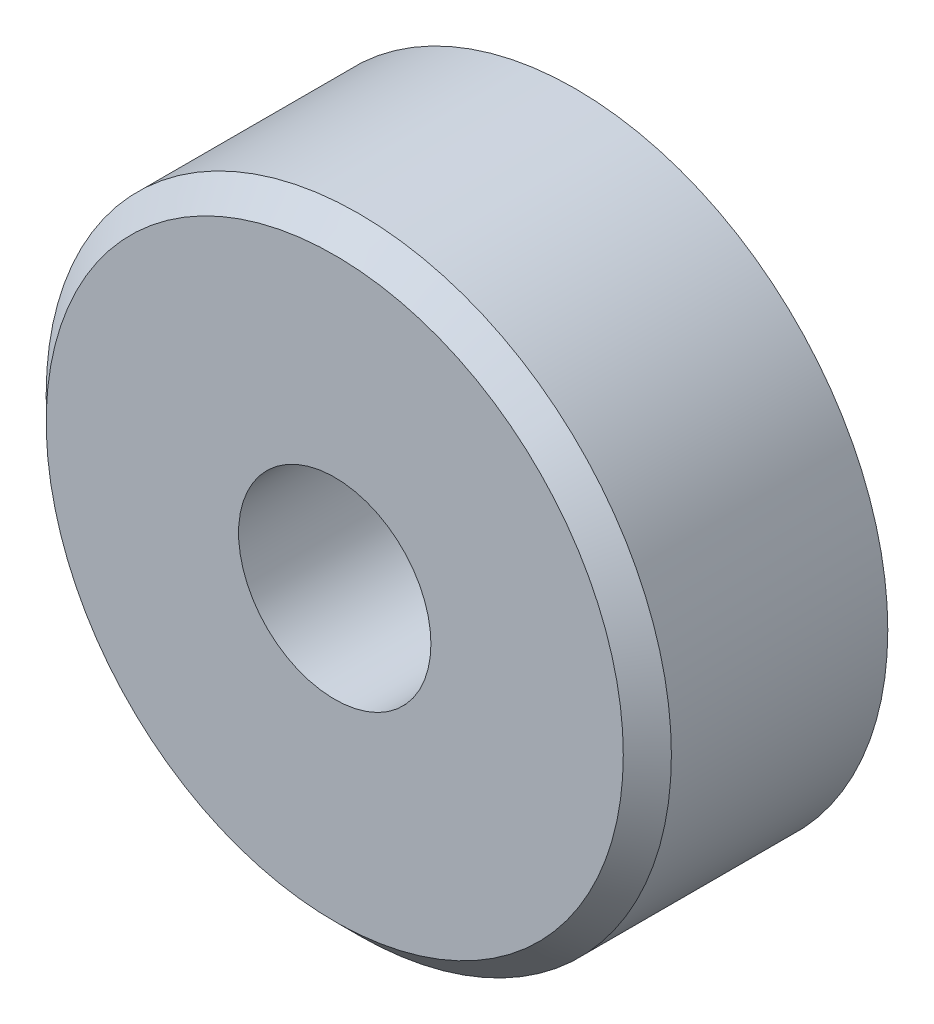
ISO-10303-21;
HEADER;
FILE_DESCRIPTION(('STEP AP214'),'2;1');
FILE_NAME('part.step','',(''),(''),'','','');
FILE_SCHEMA(('AUTOMOTIVE_DESIGN { 1 0 10303 214 1 1 1 1 }'));
ENDSEC;
DATA;
#1=APPLICATION_CONTEXT('core data for automotive mechanical design processes');
#2=APPLICATION_PROTOCOL_DEFINITION('international standard','automotive_design',2000,#1);
#3=PRODUCT_CONTEXT('',#1,'mechanical');
#4=PRODUCT('Part','Part','',(#3));
#5=PRODUCT_RELATED_PRODUCT_CATEGORY('part','',(#4));
#6=PRODUCT_DEFINITION_FORMATION('','',#4);
#7=PRODUCT_DEFINITION_CONTEXT('part definition',#1,'design');
#8=PRODUCT_DEFINITION('design','',#6,#7);
#9=PRODUCT_DEFINITION_SHAPE('','',#8);
#10=(LENGTH_UNIT() NAMED_UNIT(*) SI_UNIT(.MILLI.,.METRE.));
#11=(NAMED_UNIT(*) PLANE_ANGLE_UNIT() SI_UNIT($,.RADIAN.));
#12=(NAMED_UNIT(*) SI_UNIT($,.STERADIAN.) SOLID_ANGLE_UNIT());
#13=UNCERTAINTY_MEASURE_WITH_UNIT(LENGTH_MEASURE(1.E-05),#10,'distance_accuracy_value','');
#14=(GEOMETRIC_REPRESENTATION_CONTEXT(3) GLOBAL_UNCERTAINTY_ASSIGNED_CONTEXT((#13)) GLOBAL_UNIT_ASSIGNED_CONTEXT((#10,
#11,#12)) REPRESENTATION_CONTEXT('',''));
#15=CARTESIAN_POINT('',(0.,0.,0.));
#16=DIRECTION('',(0.,0.,1.));
#17=DIRECTION('',(1.,0.,0.));
#18=AXIS2_PLACEMENT_3D('',#15,#16,#17);
#19=CARTESIAN_POINT('',(0.,0.,2.5));
#20=DIRECTION('',(0.,0.,1.));
#21=DIRECTION('',(1.,0.,0.));
#22=AXIS2_PLACEMENT_3D('',#19,#20,#21);
#23=PLANE('',#22);
#24=CARTESIAN_POINT('',(0.,0.,2.5));
#25=DIRECTION('',(0.,0.,1.));
#26=DIRECTION('',(1.,0.,0.));
#27=AXIS2_PLACEMENT_3D('',#24,#25,#26);
#28=CIRCLE('',#27,3.);
#29=CARTESIAN_POINT('',(3.,0.,2.5));
#30=VERTEX_POINT('',#29);
#31=EDGE_CURVE('E41',#30,#30,#28,.T.);
#32=ORIENTED_EDGE('',*,*,#31,.T.);
#33=EDGE_LOOP('',(#32));
#34=FACE_BOUND('',#33,.T.);
#35=CARTESIAN_POINT('',(0.,0.,2.5));
#36=DIRECTION('',(0.,0.,1.));
#37=DIRECTION('',(1.,0.,0.));
#38=AXIS2_PLACEMENT_3D('',#35,#36,#37);
#39=CIRCLE('',#38,1.);
#40=CARTESIAN_POINT('',(1.,0.,2.5));
#41=VERTEX_POINT('',#40);
#42=EDGE_CURVE('E49',#41,#41,#39,.T.);
#43=ORIENTED_EDGE('',*,*,#42,.F.);
#44=EDGE_LOOP('',(#43));
#45=FACE_BOUND('',#44,.T.);
#46=ADVANCED_FACE('F33',(#34,#45),#23,.T.);
#47=CARTESIAN_POINT('',(0.,0.,0.));
#48=DIRECTION('',(0.,0.,1.));
#49=DIRECTION('',(1.,0.,0.));
#50=AXIS2_PLACEMENT_3D('',#47,#48,#49);
#51=PLANE('',#50);
#52=CARTESIAN_POINT('',(0.,0.,0.));
#53=DIRECTION('',(0.,0.,1.));
#54=DIRECTION('',(1.,0.,0.));
#55=AXIS2_PLACEMENT_3D('',#52,#53,#54);
#56=CIRCLE('',#55,3.25);
#57=CARTESIAN_POINT('',(3.25,0.,0.));
#58=VERTEX_POINT('',#57);
#59=EDGE_CURVE('E45',#58,#58,#56,.T.);
#60=ORIENTED_EDGE('',*,*,#59,.F.);
#61=EDGE_LOOP('',(#60));
#62=FACE_BOUND('',#61,.T.);
#63=CARTESIAN_POINT('',(0.,0.,0.));
#64=DIRECTION('',(0.,0.,1.));
#65=DIRECTION('',(1.,0.,0.));
#66=AXIS2_PLACEMENT_3D('',#63,#64,#65);
#67=CIRCLE('',#66,1.);
#68=CARTESIAN_POINT('',(1.,0.,0.));
#69=VERTEX_POINT('',#68);
#70=EDGE_CURVE('E52',#69,#69,#67,.T.);
#71=ORIENTED_EDGE('',*,*,#70,.T.);
#72=EDGE_LOOP('',(#71));
#73=FACE_BOUND('',#72,.T.);
#74=ADVANCED_FACE('F62',(#62,#73),#51,.F.);
#75=CARTESIAN_POINT('',(0.,0.,2.5));
#76=DIRECTION('',(0.,0.,-1.));
#77=DIRECTION('',(-1.,0.,0.));
#78=AXIS2_PLACEMENT_3D('',#75,#76,#77);
#79=CYLINDRICAL_SURFACE('',#78,3.25);
#80=CARTESIAN_POINT('',(0.,0.,2.25));
#81=DIRECTION('',(0.,0.,1.));
#82=DIRECTION('',(1.,0.,0.));
#83=AXIS2_PLACEMENT_3D('',#80,#81,#82);
#84=CIRCLE('',#83,3.25);
#85=CARTESIAN_POINT('',(3.25,0.,2.25));
#86=VERTEX_POINT('',#85);
#87=EDGE_CURVE('E10',#86,#86,#84,.F.);
#88=ORIENTED_EDGE('',*,*,#87,.T.);
#89=EDGE_LOOP('',(#88));
#90=FACE_BOUND('',#89,.T.);
#91=ORIENTED_EDGE('',*,*,#59,.T.);
#92=EDGE_LOOP('',(#91));
#93=FACE_BOUND('',#92,.T.);
#94=ADVANCED_FACE('F67',(#90,#93),#79,.T.);
#95=CARTESIAN_POINT('',(0.,0.,2.5));
#96=DIRECTION('',(0.,0.,-1.));
#97=DIRECTION('',(-1.,0.,0.));
#98=AXIS2_PLACEMENT_3D('',#95,#96,#97);
#99=CYLINDRICAL_SURFACE('',#98,1.);
#100=ORIENTED_EDGE('',*,*,#42,.T.);
#101=EDGE_LOOP('',(#100));
#102=FACE_BOUND('',#101,.T.);
#103=ORIENTED_EDGE('',*,*,#70,.F.);
#104=EDGE_LOOP('',(#103));
#105=FACE_BOUND('',#104,.T.);
#106=ADVANCED_FACE('F58',(#102,#105),#99,.F.);
#107=CARTESIAN_POINT('',(0.,0.,2.5));
#108=DIRECTION('',(0.,0.,-1.));
#109=DIRECTION('',(-1.,0.,0.));
#110=AXIS2_PLACEMENT_3D('',#107,#108,#109);
#111=CONICAL_SURFACE('',#110,3.,0.785398163397447);
#112=ORIENTED_EDGE('',*,*,#87,.F.);
#113=EDGE_LOOP('',(#112));
#114=FACE_BOUND('',#113,.T.);
#115=ORIENTED_EDGE('',*,*,#31,.F.);
#116=EDGE_LOOP('',(#115));
#117=FACE_BOUND('',#116,.T.);
#118=ADVANCED_FACE('F36',(#114,#117),#111,.T.);
#119=CLOSED_SHELL('',(#46,#74,#94,#106,#118));
#120=MANIFOLD_SOLID_BREP('B2',#119);
#121=ADVANCED_BREP_SHAPE_REPRESENTATION('',(#18,#120),#14);
#122=SHAPE_DEFINITION_REPRESENTATION(#9,#121);
ENDSEC;
END-ISO-10303-21;
